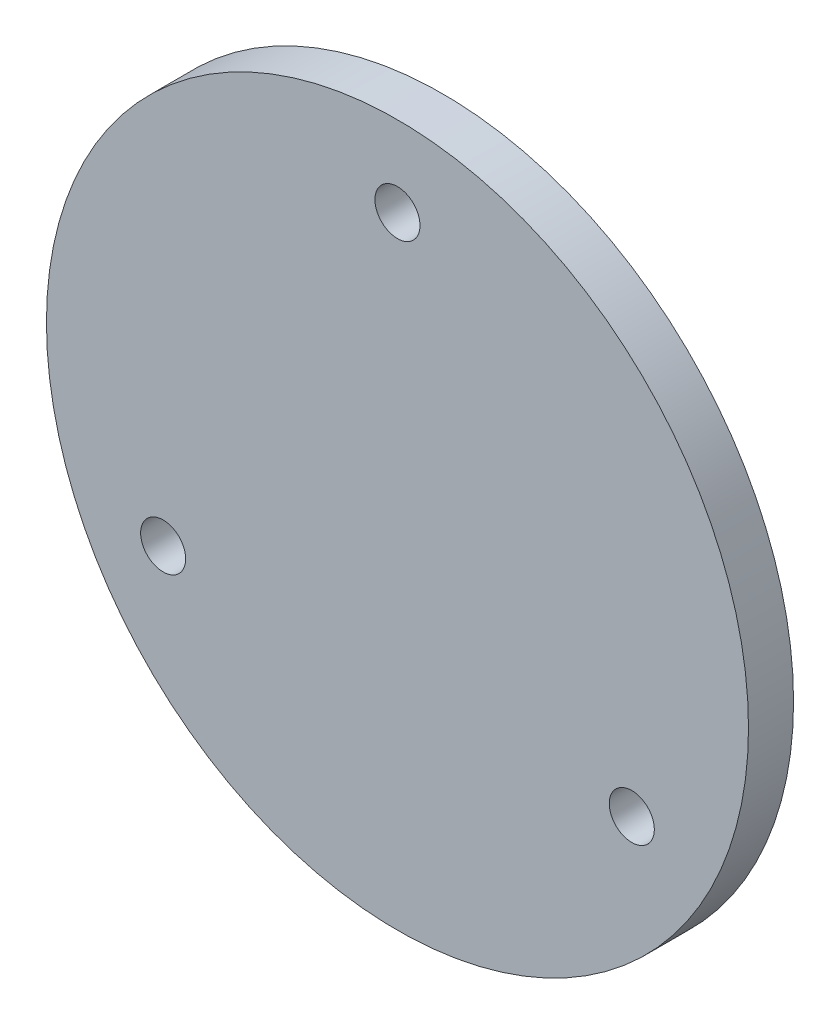
ISO-10303-21;
HEADER;
FILE_DESCRIPTION(('STEP AP214'),'2;1');
FILE_NAME('part.step','',(''),(''),'','','');
FILE_SCHEMA(('AUTOMOTIVE_DESIGN { 1 0 10303 214 1 1 1 1 }'));
ENDSEC;
DATA;
#1=APPLICATION_CONTEXT('core data for automotive mechanical design processes');
#2=APPLICATION_PROTOCOL_DEFINITION('international standard','automotive_design',2000,#1);
#3=PRODUCT_CONTEXT('',#1,'mechanical');
#4=PRODUCT('Part','Part','',(#3));
#5=PRODUCT_RELATED_PRODUCT_CATEGORY('part','',(#4));
#6=PRODUCT_DEFINITION_FORMATION('','',#4);
#7=PRODUCT_DEFINITION_CONTEXT('part definition',#1,'design');
#8=PRODUCT_DEFINITION('design','',#6,#7);
#9=PRODUCT_DEFINITION_SHAPE('','',#8);
#10=(LENGTH_UNIT() NAMED_UNIT(*) SI_UNIT(.MILLI.,.METRE.));
#11=(NAMED_UNIT(*) PLANE_ANGLE_UNIT() SI_UNIT($,.RADIAN.));
#12=(NAMED_UNIT(*) SI_UNIT($,.STERADIAN.) SOLID_ANGLE_UNIT());
#13=UNCERTAINTY_MEASURE_WITH_UNIT(LENGTH_MEASURE(1.E-05),#10,'distance_accuracy_value','');
#14=(GEOMETRIC_REPRESENTATION_CONTEXT(3) GLOBAL_UNCERTAINTY_ASSIGNED_CONTEXT((#13)) GLOBAL_UNIT_ASSIGNED_CONTEXT((#10,
#11,#12)) REPRESENTATION_CONTEXT('',''));
#15=CARTESIAN_POINT('',(0.,0.,0.));
#16=DIRECTION('',(0.,0.,1.));
#17=DIRECTION('',(1.,0.,0.));
#18=AXIS2_PLACEMENT_3D('',#15,#16,#17);
#19=CARTESIAN_POINT('',(0.,0.,6.35));
#20=DIRECTION('',(0.,0.,-1.));
#21=DIRECTION('',(-1.,0.,0.));
#22=AXIS2_PLACEMENT_3D('',#19,#20,#21);
#23=CYLINDRICAL_SURFACE('',#22,49.4665);
#24=CARTESIAN_POINT('',(0.,0.,6.35));
#25=DIRECTION('',(0.,0.,1.));
#26=DIRECTION('',(1.,0.,0.));
#27=AXIS2_PLACEMENT_3D('',#24,#25,#26);
#28=CIRCLE('',#27,49.4665);
#29=CARTESIAN_POINT('',(49.4665,0.,6.35));
#30=VERTEX_POINT('',#29);
#31=EDGE_CURVE('E10',#30,#30,#28,.T.);
#32=ORIENTED_EDGE('',*,*,#31,.F.);
#33=EDGE_LOOP('',(#32));
#34=FACE_BOUND('',#33,.T.);
#35=CARTESIAN_POINT('',(0.,0.,0.));
#36=DIRECTION('',(0.,0.,1.));
#37=DIRECTION('',(1.,0.,0.));
#38=AXIS2_PLACEMENT_3D('',#35,#36,#37);
#39=CIRCLE('',#38,49.4665);
#40=CARTESIAN_POINT('',(49.4665,0.,0.));
#41=VERTEX_POINT('',#40);
#42=EDGE_CURVE('E38',#41,#41,#39,.T.);
#43=ORIENTED_EDGE('',*,*,#42,.T.);
#44=EDGE_LOOP('',(#43));
#45=FACE_BOUND('',#44,.T.);
#46=ADVANCED_FACE('F35',(#34,#45),#23,.T.);
#47=CARTESIAN_POINT('',(0.,0.,6.35));
#48=DIRECTION('',(0.,0.,1.));
#49=DIRECTION('',(1.,0.,0.));
#50=AXIS2_PLACEMENT_3D('',#47,#48,#49);
#51=PLANE('',#50);
#52=CARTESIAN_POINT('',(0.,38.128211777283,6.35));
#53=DIRECTION('',(0.,0.,1.));
#54=DIRECTION('',(1.,0.,0.));
#55=AXIS2_PLACEMENT_3D('',#52,#53,#54);
#56=CIRCLE('',#55,3.175);
#57=CARTESIAN_POINT('',(3.175,38.128211777283,6.35));
#58=VERTEX_POINT('',#57);
#59=EDGE_CURVE('E59',#58,#58,#56,.T.);
#60=ORIENTED_EDGE('',*,*,#59,.F.);
#61=EDGE_LOOP('',(#60));
#62=FACE_BOUND('',#61,.T.);
#63=CARTESIAN_POINT('',(-33.0200000000003,-19.0641058886412,6.35));
#64=DIRECTION('',(0.,0.,1.));
#65=DIRECTION('',(1.,0.,0.));
#66=AXIS2_PLACEMENT_3D('',#63,#64,#65);
#67=CIRCLE('',#66,3.175);
#68=CARTESIAN_POINT('',(-29.8450000000003,-19.0641058886412,6.35));
#69=VERTEX_POINT('',#68);
#70=EDGE_CURVE('E53',#69,#69,#67,.T.);
#71=ORIENTED_EDGE('',*,*,#70,.F.);
#72=EDGE_LOOP('',(#71));
#73=FACE_BOUND('',#72,.T.);
#74=CARTESIAN_POINT('',(33.0200000000003,-19.0641058886412,6.35));
#75=DIRECTION('',(0.,0.,1.));
#76=DIRECTION('',(1.,0.,0.));
#77=AXIS2_PLACEMENT_3D('',#74,#75,#76);
#78=CIRCLE('',#77,3.175);
#79=CARTESIAN_POINT('',(36.1950000000003,-19.0641058886412,6.35));
#80=VERTEX_POINT('',#79);
#81=EDGE_CURVE('E47',#80,#80,#78,.T.);
#82=ORIENTED_EDGE('',*,*,#81,.F.);
#83=EDGE_LOOP('',(#82));
#84=FACE_BOUND('',#83,.T.);
#85=ORIENTED_EDGE('',*,*,#31,.T.);
#86=EDGE_LOOP('',(#85));
#87=FACE_BOUND('',#86,.T.);
#88=ADVANCED_FACE('F75',(#62,#73,#84,#87),#51,.T.);
#89=CARTESIAN_POINT('',(0.,0.,0.));
#90=DIRECTION('',(0.,0.,1.));
#91=DIRECTION('',(1.,0.,0.));
#92=AXIS2_PLACEMENT_3D('',#89,#90,#91);
#93=PLANE('',#92);
#94=CARTESIAN_POINT('',(0.,38.128211777283,0.));
#95=DIRECTION('',(0.,0.,1.));
#96=DIRECTION('',(1.,0.,0.));
#97=AXIS2_PLACEMENT_3D('',#94,#95,#96);
#98=CIRCLE('',#97,3.175);
#99=CARTESIAN_POINT('',(3.175,38.128211777283,0.));
#100=VERTEX_POINT('',#99);
#101=EDGE_CURVE('E45',#100,#100,#98,.T.);
#102=ORIENTED_EDGE('',*,*,#101,.T.);
#103=EDGE_LOOP('',(#102));
#104=FACE_BOUND('',#103,.T.);
#105=CARTESIAN_POINT('',(-33.0200000000003,-19.0641058886412,0.));
#106=DIRECTION('',(0.,0.,1.));
#107=DIRECTION('',(1.,0.,0.));
#108=AXIS2_PLACEMENT_3D('',#105,#106,#107);
#109=CIRCLE('',#108,3.175);
#110=CARTESIAN_POINT('',(-29.8450000000003,-19.0641058886412,0.));
#111=VERTEX_POINT('',#110);
#112=EDGE_CURVE('E56',#111,#111,#109,.T.);
#113=ORIENTED_EDGE('',*,*,#112,.T.);
#114=EDGE_LOOP('',(#113));
#115=FACE_BOUND('',#114,.T.);
#116=CARTESIAN_POINT('',(33.0200000000003,-19.0641058886412,0.));
#117=DIRECTION('',(0.,0.,1.));
#118=DIRECTION('',(1.,0.,0.));
#119=AXIS2_PLACEMENT_3D('',#116,#117,#118);
#120=CIRCLE('',#119,3.175);
#121=CARTESIAN_POINT('',(36.1950000000003,-19.0641058886412,0.));
#122=VERTEX_POINT('',#121);
#123=EDGE_CURVE('E50',#122,#122,#120,.T.);
#124=ORIENTED_EDGE('',*,*,#123,.T.);
#125=EDGE_LOOP('',(#124));
#126=FACE_BOUND('',#125,.T.);
#127=ORIENTED_EDGE('',*,*,#42,.F.);
#128=EDGE_LOOP('',(#127));
#129=FACE_BOUND('',#128,.T.);
#130=ADVANCED_FACE('F65',(#104,#115,#126,#129),#93,.F.);
#131=CARTESIAN_POINT('',(33.0200000000003,-19.0641058886412,0.));
#132=DIRECTION('',(0.,0.,1.));
#133=DIRECTION('',(1.,0.,0.));
#134=AXIS2_PLACEMENT_3D('',#131,#132,#133);
#135=CYLINDRICAL_SURFACE('',#134,3.175);
#136=ORIENTED_EDGE('',*,*,#123,.F.);
#137=EDGE_LOOP('',(#136));
#138=FACE_BOUND('',#137,.T.);
#139=ORIENTED_EDGE('',*,*,#81,.T.);
#140=EDGE_LOOP('',(#139));
#141=FACE_BOUND('',#140,.T.);
#142=ADVANCED_FACE('F83',(#138,#141),#135,.F.);
#143=CARTESIAN_POINT('',(-33.0200000000003,-19.0641058886412,0.));
#144=DIRECTION('',(0.,0.,1.));
#145=DIRECTION('',(1.,0.,0.));
#146=AXIS2_PLACEMENT_3D('',#143,#144,#145);
#147=CYLINDRICAL_SURFACE('',#146,3.175);
#148=ORIENTED_EDGE('',*,*,#112,.F.);
#149=EDGE_LOOP('',(#148));
#150=FACE_BOUND('',#149,.T.);
#151=ORIENTED_EDGE('',*,*,#70,.T.);
#152=EDGE_LOOP('',(#151));
#153=FACE_BOUND('',#152,.T.);
#154=ADVANCED_FACE('F71',(#150,#153),#147,.F.);
#155=CARTESIAN_POINT('',(0.,38.128211777283,0.));
#156=DIRECTION('',(0.,0.,1.));
#157=DIRECTION('',(1.,0.,0.));
#158=AXIS2_PLACEMENT_3D('',#155,#156,#157);
#159=CYLINDRICAL_SURFACE('',#158,3.175);
#160=ORIENTED_EDGE('',*,*,#101,.F.);
#161=EDGE_LOOP('',(#160));
#162=FACE_BOUND('',#161,.T.);
#163=ORIENTED_EDGE('',*,*,#59,.T.);
#164=EDGE_LOOP('',(#163));
#165=FACE_BOUND('',#164,.T.);
#166=ADVANCED_FACE('F68',(#162,#165),#159,.F.);
#167=CLOSED_SHELL('',(#46,#88,#130,#142,#154,#166));
#168=MANIFOLD_SOLID_BREP('B2',#167);
#169=ADVANCED_BREP_SHAPE_REPRESENTATION('',(#18,#168),#14);
#170=SHAPE_DEFINITION_REPRESENTATION(#9,#169);
ENDSEC;
END-ISO-10303-21;
